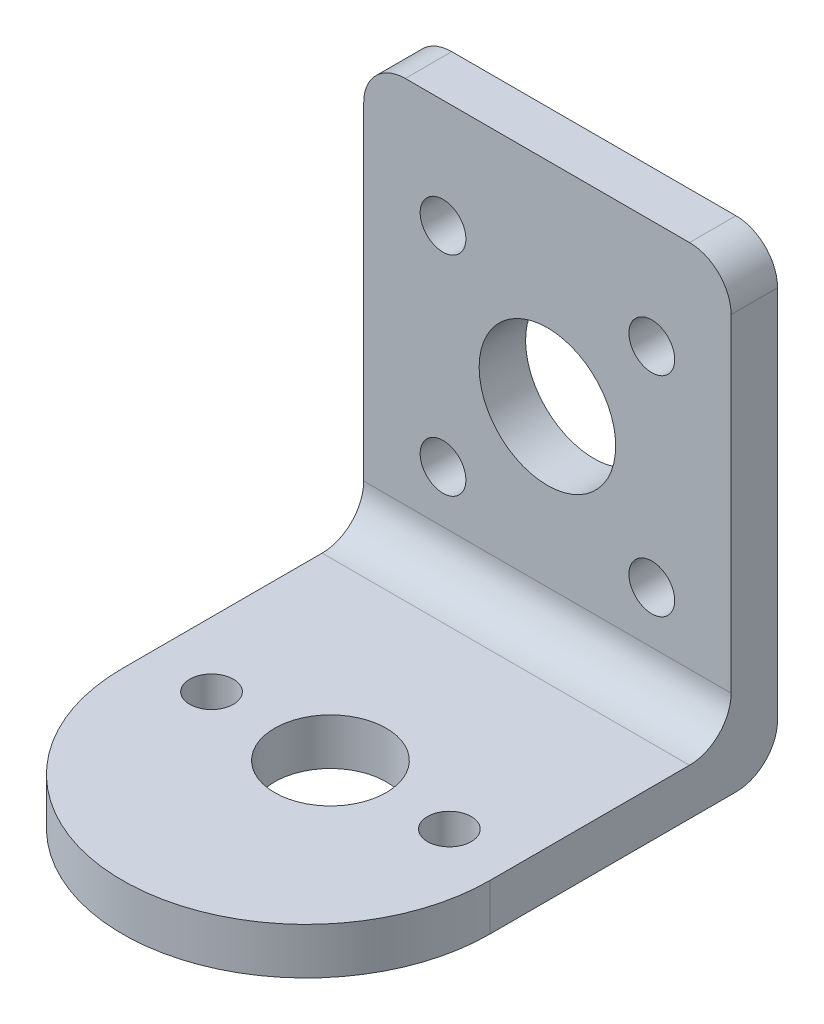
ISO-10303-21;
HEADER;
FILE_DESCRIPTION(('STEP AP214'),'2;1');
FILE_NAME('part.step','',(''),(''),'','','');
FILE_SCHEMA(('AUTOMOTIVE_DESIGN { 1 0 10303 214 1 1 1 1 }'));
ENDSEC;
DATA;
#1=APPLICATION_CONTEXT('core data for automotive mechanical design processes');
#2=APPLICATION_PROTOCOL_DEFINITION('international standard','automotive_design',2000,#1);
#3=PRODUCT_CONTEXT('',#1,'mechanical');
#4=PRODUCT('Part','Part','',(#3));
#5=PRODUCT_RELATED_PRODUCT_CATEGORY('part','',(#4));
#6=PRODUCT_DEFINITION_FORMATION('','',#4);
#7=PRODUCT_DEFINITION_CONTEXT('part definition',#1,'design');
#8=PRODUCT_DEFINITION('design','',#6,#7);
#9=PRODUCT_DEFINITION_SHAPE('','',#8);
#10=(LENGTH_UNIT() NAMED_UNIT(*) SI_UNIT(.MILLI.,.METRE.));
#11=(NAMED_UNIT(*) PLANE_ANGLE_UNIT() SI_UNIT($,.RADIAN.));
#12=(NAMED_UNIT(*) SI_UNIT($,.STERADIAN.) SOLID_ANGLE_UNIT());
#13=UNCERTAINTY_MEASURE_WITH_UNIT(LENGTH_MEASURE(1.E-05),#10,'distance_accuracy_value','');
#14=(GEOMETRIC_REPRESENTATION_CONTEXT(3) GLOBAL_UNCERTAINTY_ASSIGNED_CONTEXT((#13)) GLOBAL_UNIT_ASSIGNED_CONTEXT((#10,
#11,#12)) REPRESENTATION_CONTEXT('',''));
#15=CARTESIAN_POINT('',(0.,0.,0.));
#16=DIRECTION('',(0.,0.,1.));
#17=DIRECTION('',(1.,0.,0.));
#18=AXIS2_PLACEMENT_3D('',#15,#16,#17);
#19=CARTESIAN_POINT('',(5.71931278036326,25.1605271026006,0.));
#20=DIRECTION('',(0.,0.,-1.));
#21=DIRECTION('',(0.,1.,0.));
#22=AXIS2_PLACEMENT_3D('',#19,#20,#21);
#23=CYLINDRICAL_SURFACE('',#22,1.65);
#24=CARTESIAN_POINT('',(5.71931278036326,25.1605271026006,-34.));
#25=DIRECTION('',(0.,0.,-1.));
#26=DIRECTION('',(0.,-1.,0.));
#27=AXIS2_PLACEMENT_3D('',#24,#25,#26);
#28=CIRCLE('',#27,1.65);
#29=CARTESIAN_POINT('',(5.71931278036326,23.5105271026006,-34.));
#30=VERTEX_POINT('',#29);
#31=EDGE_CURVE('E281',#30,#30,#28,.T.);
#32=ORIENTED_EDGE('',*,*,#31,.T.);
#33=EDGE_LOOP('',(#32));
#34=FACE_BOUND('',#33,.T.);
#35=CARTESIAN_POINT('',(5.71931278036326,25.1605271026006,-30.65));
#36=DIRECTION('',(0.,0.,1.));
#37=DIRECTION('',(0.,-1.,0.));
#38=AXIS2_PLACEMENT_3D('',#35,#36,#37);
#39=CIRCLE('',#38,1.65);
#40=CARTESIAN_POINT('',(5.71931278036326,23.5105271026006,-30.65));
#41=VERTEX_POINT('',#40);
#42=EDGE_CURVE('E317',#41,#41,#39,.T.);
#43=ORIENTED_EDGE('',*,*,#42,.T.);
#44=EDGE_LOOP('',(#43));
#45=FACE_BOUND('',#44,.T.);
#46=ADVANCED_FACE('F16',(#34,#45),#23,.F.);
#47=CARTESIAN_POINT('',(20.7806872196367,25.1605271026006,0.));
#48=DIRECTION('',(0.,0.,-1.));
#49=DIRECTION('',(0.,1.,0.));
#50=AXIS2_PLACEMENT_3D('',#47,#48,#49);
#51=CYLINDRICAL_SURFACE('',#50,1.65);
#52=CARTESIAN_POINT('',(20.7806872196367,25.1605271026006,-34.));
#53=DIRECTION('',(0.,0.,-1.));
#54=DIRECTION('',(0.,1.,0.));
#55=AXIS2_PLACEMENT_3D('',#52,#53,#54);
#56=CIRCLE('',#55,1.65);
#57=CARTESIAN_POINT('',(20.7806872196367,26.8105271026006,-34.));
#58=VERTEX_POINT('',#57);
#59=EDGE_CURVE('E278',#58,#58,#56,.T.);
#60=ORIENTED_EDGE('',*,*,#59,.T.);
#61=EDGE_LOOP('',(#60));
#62=FACE_BOUND('',#61,.T.);
#63=CARTESIAN_POINT('',(20.7806872196367,25.1605271026006,-30.65));
#64=DIRECTION('',(0.,0.,1.));
#65=DIRECTION('',(0.,-1.,0.));
#66=AXIS2_PLACEMENT_3D('',#63,#64,#65);
#67=CIRCLE('',#66,1.65);
#68=CARTESIAN_POINT('',(20.7806872196367,23.5105271026006,-30.65));
#69=VERTEX_POINT('',#68);
#70=EDGE_CURVE('E320',#69,#69,#67,.T.);
#71=ORIENTED_EDGE('',*,*,#70,.T.);
#72=EDGE_LOOP('',(#71));
#73=FACE_BOUND('',#72,.T.);
#74=ADVANCED_FACE('F344',(#62,#73),#51,.F.);
#75=CARTESIAN_POINT('',(20.7806872196367,10.0991526633271,0.));
#76=DIRECTION('',(0.,0.,-1.));
#77=DIRECTION('',(0.,1.,0.));
#78=AXIS2_PLACEMENT_3D('',#75,#76,#77);
#79=CYLINDRICAL_SURFACE('',#78,1.65);
#80=CARTESIAN_POINT('',(20.7806872196367,10.0991526633271,-34.));
#81=DIRECTION('',(0.,0.,-1.));
#82=DIRECTION('',(0.,-1.,0.));
#83=AXIS2_PLACEMENT_3D('',#80,#81,#82);
#84=CIRCLE('',#83,1.65);
#85=CARTESIAN_POINT('',(20.7806872196367,8.4491526633271,-34.));
#86=VERTEX_POINT('',#85);
#87=EDGE_CURVE('E275',#86,#86,#84,.T.);
#88=ORIENTED_EDGE('',*,*,#87,.T.);
#89=EDGE_LOOP('',(#88));
#90=FACE_BOUND('',#89,.T.);
#91=CARTESIAN_POINT('',(20.7806872196367,10.0991526633271,-30.65));
#92=DIRECTION('',(0.,0.,1.));
#93=DIRECTION('',(0.,-1.,0.));
#94=AXIS2_PLACEMENT_3D('',#91,#92,#93);
#95=CIRCLE('',#94,1.65);
#96=CARTESIAN_POINT('',(20.7806872196367,8.4491526633271,-30.65));
#97=VERTEX_POINT('',#96);
#98=EDGE_CURVE('E323',#97,#97,#95,.T.);
#99=ORIENTED_EDGE('',*,*,#98,.T.);
#100=EDGE_LOOP('',(#99));
#101=FACE_BOUND('',#100,.T.);
#102=ADVANCED_FACE('F350',(#90,#101),#79,.F.);
#103=CARTESIAN_POINT('',(5.71931278036326,10.0991526633271,0.));
#104=DIRECTION('',(0.,0.,-1.));
#105=DIRECTION('',(0.,1.,0.));
#106=AXIS2_PLACEMENT_3D('',#103,#104,#105);
#107=CYLINDRICAL_SURFACE('',#106,1.65);
#108=CARTESIAN_POINT('',(5.71931278036326,10.0991526633271,-34.));
#109=DIRECTION('',(0.,0.,-1.));
#110=DIRECTION('',(0.,1.,0.));
#111=AXIS2_PLACEMENT_3D('',#108,#109,#110);
#112=CIRCLE('',#111,1.65);
#113=CARTESIAN_POINT('',(5.71931278036326,11.7491526633271,-34.));
#114=VERTEX_POINT('',#113);
#115=EDGE_CURVE('E271',#114,#114,#112,.T.);
#116=ORIENTED_EDGE('',*,*,#115,.T.);
#117=EDGE_LOOP('',(#116));
#118=FACE_BOUND('',#117,.T.);
#119=CARTESIAN_POINT('',(5.71931278036326,10.0991526633271,-30.65));
#120=DIRECTION('',(0.,0.,1.));
#121=DIRECTION('',(0.,-1.,0.));
#122=AXIS2_PLACEMENT_3D('',#119,#120,#121);
#123=CIRCLE('',#122,1.65);
#124=CARTESIAN_POINT('',(5.71931278036326,8.4491526633271,-30.65));
#125=VERTEX_POINT('',#124);
#126=EDGE_CURVE('E189',#125,#125,#123,.T.);
#127=ORIENTED_EDGE('',*,*,#126,.T.);
#128=EDGE_LOOP('',(#127));
#129=FACE_BOUND('',#128,.T.);
#130=ADVANCED_FACE('F331',(#118,#129),#107,.F.);
#131=CARTESIAN_POINT('',(13.25,17.6298398829639,0.));
#132=DIRECTION('',(0.,0.,-1.));
#133=DIRECTION('',(0.,1.,0.));
#134=AXIS2_PLACEMENT_3D('',#131,#132,#133);
#135=CYLINDRICAL_SURFACE('',#134,4.925);
#136=CARTESIAN_POINT('',(13.25,17.6298398829639,-34.));
#137=DIRECTION('',(0.,0.,-1.));
#138=DIRECTION('',(0.,1.,0.));
#139=AXIS2_PLACEMENT_3D('',#136,#137,#138);
#140=CIRCLE('',#139,4.925);
#141=CARTESIAN_POINT('',(13.25,22.5548398829639,-34.));
#142=VERTEX_POINT('',#141);
#143=EDGE_CURVE('E274',#142,#142,#140,.T.);
#144=ORIENTED_EDGE('',*,*,#143,.T.);
#145=EDGE_LOOP('',(#144));
#146=FACE_BOUND('',#145,.T.);
#147=CARTESIAN_POINT('',(13.25,17.6298398829639,-30.65));
#148=DIRECTION('',(0.,0.,1.));
#149=DIRECTION('',(0.,-1.,0.));
#150=AXIS2_PLACEMENT_3D('',#147,#148,#149);
#151=CIRCLE('',#150,4.925);
#152=CARTESIAN_POINT('',(13.25,12.7048398829639,-30.65));
#153=VERTEX_POINT('',#152);
#154=EDGE_CURVE('E181',#153,#153,#151,.T.);
#155=ORIENTED_EDGE('',*,*,#154,.T.);
#156=EDGE_LOOP('',(#155));
#157=FACE_BOUND('',#156,.T.);
#158=ADVANCED_FACE('F380',(#146,#157),#135,.F.);
#159=CARTESIAN_POINT('',(3.,30.,-34.));
#160=DIRECTION('',(0.,0.,-1.));
#161=DIRECTION('',(0.,1.,0.));
#162=AXIS2_PLACEMENT_3D('',#159,#160,#161);
#163=CYLINDRICAL_SURFACE('',#162,3.);
#164=CARTESIAN_POINT('',(3.,30.,-34.));
#165=DIRECTION('',(0.,0.,-1.));
#166=DIRECTION('',(0.,-1.,0.));
#167=AXIS2_PLACEMENT_3D('',#164,#165,#166);
#168=CIRCLE('',#167,3.);
#169=CARTESIAN_POINT('',(0.,30.,-34.));
#170=VERTEX_POINT('',#169);
#171=CARTESIAN_POINT('',(3.,33.,-34.));
#172=VERTEX_POINT('',#171);
#173=EDGE_CURVE('E257',#170,#172,#168,.T.);
#174=ORIENTED_EDGE('',*,*,#173,.F.);
#175=DIRECTION('',(0.,0.,-1.));
#176=VECTOR('',#175,1.);
#177=CARTESIAN_POINT('',(0.,30.,-34.));
#178=LINE('',#177,#176);
#179=CARTESIAN_POINT('',(0.,30.,-30.65));
#180=VERTEX_POINT('',#179);
#181=EDGE_CURVE('E47',#180,#170,#178,.T.);
#182=ORIENTED_EDGE('',*,*,#181,.F.);
#183=CARTESIAN_POINT('',(3.,30.,-30.65));
#184=DIRECTION('',(0.,0.,1.));
#185=DIRECTION('',(0.,-1.,0.));
#186=AXIS2_PLACEMENT_3D('',#183,#184,#185);
#187=CIRCLE('',#186,3.);
#188=CARTESIAN_POINT('',(3.,33.,-30.65));
#189=VERTEX_POINT('',#188);
#190=EDGE_CURVE('E187',#189,#180,#187,.T.);
#191=ORIENTED_EDGE('',*,*,#190,.F.);
#192=DIRECTION('',(0.,0.,1.));
#193=VECTOR('',#192,1.);
#194=CARTESIAN_POINT('',(3.,33.,-30.65));
#195=LINE('',#194,#193);
#196=EDGE_CURVE('E313',#172,#189,#195,.T.);
#197=ORIENTED_EDGE('',*,*,#196,.F.);
#198=EDGE_LOOP('',(#174,#182,#191,#197));
#199=FACE_BOUND('',#198,.T.);
#200=ADVANCED_FACE('F383',(#199),#163,.T.);
#201=CARTESIAN_POINT('',(23.5,30.,0.));
#202=DIRECTION('',(0.,0.,1.));
#203=DIRECTION('',(0.,-1.,0.));
#204=AXIS2_PLACEMENT_3D('',#201,#202,#203);
#205=CYLINDRICAL_SURFACE('',#204,3.);
#206=CARTESIAN_POINT('',(23.5,30.,-34.));
#207=DIRECTION('',(0.,0.,-1.));
#208=DIRECTION('',(0.,-1.,0.));
#209=AXIS2_PLACEMENT_3D('',#206,#207,#208);
#210=CIRCLE('',#209,3.);
#211=CARTESIAN_POINT('',(23.5,33.,-34.));
#212=VERTEX_POINT('',#211);
#213=CARTESIAN_POINT('',(26.5,30.,-34.));
#214=VERTEX_POINT('',#213);
#215=EDGE_CURVE('E293',#212,#214,#210,.T.);
#216=ORIENTED_EDGE('',*,*,#215,.F.);
#217=DIRECTION('',(0.,0.,-1.));
#218=VECTOR('',#217,1.);
#219=CARTESIAN_POINT('',(23.5,33.,-34.));
#220=LINE('',#219,#218);
#221=CARTESIAN_POINT('',(23.5,33.,-30.65));
#222=VERTEX_POINT('',#221);
#223=EDGE_CURVE('E256',#222,#212,#220,.T.);
#224=ORIENTED_EDGE('',*,*,#223,.F.);
#225=CARTESIAN_POINT('',(23.5,30.,-30.65));
#226=DIRECTION('',(0.,0.,1.));
#227=DIRECTION('',(0.,-1.,0.));
#228=AXIS2_PLACEMENT_3D('',#225,#226,#227);
#229=CIRCLE('',#228,3.);
#230=CARTESIAN_POINT('',(26.5,30.,-30.65));
#231=VERTEX_POINT('',#230);
#232=EDGE_CURVE('E180',#231,#222,#229,.T.);
#233=ORIENTED_EDGE('',*,*,#232,.F.);
#234=DIRECTION('',(0.,0.,1.));
#235=VECTOR('',#234,1.);
#236=CARTESIAN_POINT('',(26.5,30.,0.));
#237=LINE('',#236,#235);
#238=EDGE_CURVE('E165',#214,#231,#237,.T.);
#239=ORIENTED_EDGE('',*,*,#238,.F.);
#240=EDGE_LOOP('',(#216,#224,#233,#239));
#241=FACE_BOUND('',#240,.T.);
#242=ADVANCED_FACE('F395',(#241),#205,.T.);
#243=CARTESIAN_POINT('',(26.5,3.,-31.));
#244=DIRECTION('',(-1.,0.,0.));
#245=DIRECTION('',(0.,-1.,0.));
#246=AXIS2_PLACEMENT_3D('',#243,#244,#245);
#247=CYLINDRICAL_SURFACE('',#246,3.);
#248=CARTESIAN_POINT('',(26.5,3.,-31.));
#249=DIRECTION('',(1.,0.,0.));
#250=DIRECTION('',(0.,-1.,0.));
#251=AXIS2_PLACEMENT_3D('',#248,#249,#250);
#252=CIRCLE('',#251,3.);
#253=CARTESIAN_POINT('',(26.5,0.,-31.));
#254=VERTEX_POINT('',#253);
#255=CARTESIAN_POINT('',(26.5,3.,-34.));
#256=VERTEX_POINT('',#255);
#257=EDGE_CURVE('E201',#254,#256,#252,.T.);
#258=ORIENTED_EDGE('',*,*,#257,.F.);
#259=DIRECTION('',(1.,0.,0.));
#260=VECTOR('',#259,1.);
#261=CARTESIAN_POINT('',(26.5,0.,-31.));
#262=LINE('',#261,#260);
#263=CARTESIAN_POINT('',(0.,0.,-31.));
#264=VERTEX_POINT('',#263);
#265=EDGE_CURVE('E241',#264,#254,#262,.T.);
#266=ORIENTED_EDGE('',*,*,#265,.F.);
#267=CARTESIAN_POINT('',(0.,3.,-31.));
#268=DIRECTION('',(-1.,0.,0.));
#269=DIRECTION('',(0.,-1.,0.));
#270=AXIS2_PLACEMENT_3D('',#267,#268,#269);
#271=CIRCLE('',#270,3.);
#272=CARTESIAN_POINT('',(0.,3.,-34.));
#273=VERTEX_POINT('',#272);
#274=EDGE_CURVE('E204',#273,#264,#271,.T.);
#275=ORIENTED_EDGE('',*,*,#274,.F.);
#276=DIRECTION('',(-1.,0.,0.));
#277=VECTOR('',#276,1.);
#278=CARTESIAN_POINT('',(26.5,3.,-34.));
#279=LINE('',#278,#277);
#280=EDGE_CURVE('E300',#256,#273,#279,.T.);
#281=ORIENTED_EDGE('',*,*,#280,.F.);
#282=EDGE_LOOP('',(#258,#266,#275,#281));
#283=FACE_BOUND('',#282,.T.);
#284=ADVANCED_FACE('F398',(#283),#247,.T.);
#285=CARTESIAN_POINT('',(26.5,6.35,-27.65));
#286=DIRECTION('',(1.,0.,0.));
#287=DIRECTION('',(0.,1.,0.));
#288=AXIS2_PLACEMENT_3D('',#285,#286,#287);
#289=CYLINDRICAL_SURFACE('',#288,3.);
#290=CARTESIAN_POINT('',(26.5,6.35,-27.65));
#291=DIRECTION('',(-1.,0.,0.));
#292=DIRECTION('',(0.,-1.,0.));
#293=AXIS2_PLACEMENT_3D('',#290,#291,#292);
#294=CIRCLE('',#293,3.);
#295=CARTESIAN_POINT('',(26.5,6.35,-30.65));
#296=VERTEX_POINT('',#295);
#297=CARTESIAN_POINT('',(26.5,3.35,-27.65));
#298=VERTEX_POINT('',#297);
#299=EDGE_CURVE('E152',#296,#298,#294,.T.);
#300=ORIENTED_EDGE('',*,*,#299,.F.);
#301=DIRECTION('',(1.,0.,0.));
#302=VECTOR('',#301,1.);
#303=CARTESIAN_POINT('',(26.5,6.35,-30.65));
#304=LINE('',#303,#302);
#305=CARTESIAN_POINT('',(0.,6.35,-30.65));
#306=VERTEX_POINT('',#305);
#307=EDGE_CURVE('E155',#306,#296,#304,.T.);
#308=ORIENTED_EDGE('',*,*,#307,.F.);
#309=CARTESIAN_POINT('',(0.,6.35,-27.65));
#310=DIRECTION('',(1.,0.,0.));
#311=DIRECTION('',(0.,-1.,0.));
#312=AXIS2_PLACEMENT_3D('',#309,#310,#311);
#313=CIRCLE('',#312,3.);
#314=CARTESIAN_POINT('',(0.,3.35,-27.65));
#315=VERTEX_POINT('',#314);
#316=EDGE_CURVE('E10',#315,#306,#313,.T.);
#317=ORIENTED_EDGE('',*,*,#316,.F.);
#318=DIRECTION('',(-1.,0.,0.));
#319=VECTOR('',#318,1.);
#320=CARTESIAN_POINT('',(0.,3.35,-27.65));
#321=LINE('',#320,#319);
#322=EDGE_CURVE('E158',#298,#315,#321,.T.);
#323=ORIENTED_EDGE('',*,*,#322,.F.);
#324=EDGE_LOOP('',(#300,#308,#317,#323));
#325=FACE_BOUND('',#324,.T.);
#326=ADVANCED_FACE('F154',(#325),#289,.F.);
#327=CARTESIAN_POINT('',(21.8275,33.,-15.));
#328=DIRECTION('',(0.,-1.,0.));
#329=DIRECTION('',(1.,0.,0.));
#330=AXIS2_PLACEMENT_3D('',#327,#328,#329);
#331=CYLINDRICAL_SURFACE('',#330,1.575);
#332=CARTESIAN_POINT('',(21.8275,0.,-15.));
#333=DIRECTION('',(0.,-1.,0.));
#334=DIRECTION('',(-1.,0.,0.));
#335=AXIS2_PLACEMENT_3D('',#332,#333,#334);
#336=CIRCLE('',#335,1.575);
#337=CARTESIAN_POINT('',(20.2525,0.,-15.));
#338=VERTEX_POINT('',#337);
#339=EDGE_CURVE('E699',#338,#338,#336,.T.);
#340=ORIENTED_EDGE('',*,*,#339,.T.);
#341=EDGE_LOOP('',(#340));
#342=FACE_BOUND('',#341,.T.);
#343=CARTESIAN_POINT('',(21.8275,3.35,-15.));
#344=DIRECTION('',(0.,1.,0.));
#345=DIRECTION('',(0.,0.,1.));
#346=AXIS2_PLACEMENT_3D('',#343,#344,#345);
#347=CIRCLE('',#346,1.575);
#348=CARTESIAN_POINT('',(21.8275,3.35,-13.425));
#349=VERTEX_POINT('',#348);
#350=EDGE_CURVE('E235',#349,#349,#347,.T.);
#351=ORIENTED_EDGE('',*,*,#350,.T.);
#352=EDGE_LOOP('',(#351));
#353=FACE_BOUND('',#352,.T.);
#354=ADVANCED_FACE('F388',(#342,#353),#331,.F.);
#355=CARTESIAN_POINT('',(4.6725,33.,-15.));
#356=DIRECTION('',(0.,-1.,0.));
#357=DIRECTION('',(1.,0.,0.));
#358=AXIS2_PLACEMENT_3D('',#355,#356,#357);
#359=CYLINDRICAL_SURFACE('',#358,1.575);
#360=CARTESIAN_POINT('',(4.6725,0.,-15.));
#361=DIRECTION('',(0.,-1.,0.));
#362=DIRECTION('',(1.,0.,0.));
#363=AXIS2_PLACEMENT_3D('',#360,#361,#362);
#364=CIRCLE('',#363,1.575);
#365=CARTESIAN_POINT('',(6.2475,0.,-15.));
#366=VERTEX_POINT('',#365);
#367=EDGE_CURVE('E249',#366,#366,#364,.T.);
#368=ORIENTED_EDGE('',*,*,#367,.T.);
#369=EDGE_LOOP('',(#368));
#370=FACE_BOUND('',#369,.T.);
#371=CARTESIAN_POINT('',(4.6725,3.35,-15.));
#372=DIRECTION('',(0.,1.,0.));
#373=DIRECTION('',(0.,0.,1.));
#374=AXIS2_PLACEMENT_3D('',#371,#372,#373);
#375=CIRCLE('',#374,1.575);
#376=CARTESIAN_POINT('',(4.6725,3.35,-13.425));
#377=VERTEX_POINT('',#376);
#378=EDGE_CURVE('E261',#377,#377,#375,.T.);
#379=ORIENTED_EDGE('',*,*,#378,.T.);
#380=EDGE_LOOP('',(#379));
#381=FACE_BOUND('',#380,.T.);
#382=ADVANCED_FACE('F385',(#370,#381),#359,.F.);
#383=CARTESIAN_POINT('',(13.25,33.,-15.));
#384=DIRECTION('',(0.,-1.,0.));
#385=DIRECTION('',(1.,0.,0.));
#386=AXIS2_PLACEMENT_3D('',#383,#384,#385);
#387=CYLINDRICAL_SURFACE('',#386,4.025);
#388=CARTESIAN_POINT('',(13.25,0.,-15.));
#389=DIRECTION('',(0.,-1.,0.));
#390=DIRECTION('',(1.,0.,0.));
#391=AXIS2_PLACEMENT_3D('',#388,#389,#390);
#392=CIRCLE('',#391,4.025);
#393=CARTESIAN_POINT('',(17.275,0.,-15.));
#394=VERTEX_POINT('',#393);
#395=EDGE_CURVE('E242',#394,#394,#392,.T.);
#396=ORIENTED_EDGE('',*,*,#395,.T.);
#397=EDGE_LOOP('',(#396));
#398=FACE_BOUND('',#397,.T.);
#399=CARTESIAN_POINT('',(13.25,3.35,-15.));
#400=DIRECTION('',(0.,1.,0.));
#401=DIRECTION('',(0.,0.,1.));
#402=AXIS2_PLACEMENT_3D('',#399,#400,#401);
#403=CIRCLE('',#402,4.025);
#404=CARTESIAN_POINT('',(13.25,3.35,-10.975));
#405=VERTEX_POINT('',#404);
#406=EDGE_CURVE('E268',#405,#405,#403,.T.);
#407=ORIENTED_EDGE('',*,*,#406,.T.);
#408=EDGE_LOOP('',(#407));
#409=FACE_BOUND('',#408,.T.);
#410=ADVANCED_FACE('F379',(#398,#409),#387,.F.);
#411=CARTESIAN_POINT('',(13.25,33.,-13.25));
#412=DIRECTION('',(0.,-1.,0.));
#413=DIRECTION('',(1.,0.,0.));
#414=AXIS2_PLACEMENT_3D('',#411,#412,#413);
#415=CYLINDRICAL_SURFACE('',#414,13.25);
#416=DIRECTION('',(0.,-1.,0.));
#417=VECTOR('',#416,1.);
#418=CARTESIAN_POINT('',(0.,33.,-13.25));
#419=LINE('',#418,#417);
#420=CARTESIAN_POINT('',(0.,3.35,-13.25));
#421=VERTEX_POINT('',#420);
#422=CARTESIAN_POINT('',(0.,0.,-13.25));
#423=VERTEX_POINT('',#422);
#424=EDGE_CURVE('E24',#421,#423,#419,.T.);
#425=ORIENTED_EDGE('',*,*,#424,.T.);
#426=CARTESIAN_POINT('',(13.25,0.,-13.25));
#427=DIRECTION('',(0.,-1.,0.));
#428=DIRECTION('',(1.,0.,0.));
#429=AXIS2_PLACEMENT_3D('',#426,#427,#428);
#430=CIRCLE('',#429,13.25);
#431=CARTESIAN_POINT('',(26.5,0.,-13.25));
#432=VERTEX_POINT('',#431);
#433=EDGE_CURVE('E217',#432,#423,#430,.T.);
#434=ORIENTED_EDGE('',*,*,#433,.F.);
#435=DIRECTION('',(0.,-1.,0.));
#436=VECTOR('',#435,1.);
#437=CARTESIAN_POINT('',(26.5,33.,-13.25));
#438=LINE('',#437,#436);
#439=CARTESIAN_POINT('',(26.5,3.35,-13.25));
#440=VERTEX_POINT('',#439);
#441=EDGE_CURVE('E164',#440,#432,#438,.T.);
#442=ORIENTED_EDGE('',*,*,#441,.F.);
#443=CARTESIAN_POINT('',(13.25,3.35,-13.25));
#444=DIRECTION('',(0.,1.,0.));
#445=DIRECTION('',(0.,0.,1.));
#446=AXIS2_PLACEMENT_3D('',#443,#444,#445);
#447=CIRCLE('',#446,13.25);
#448=EDGE_CURVE('E220',#421,#440,#447,.T.);
#449=ORIENTED_EDGE('',*,*,#448,.F.);
#450=EDGE_LOOP('',(#425,#434,#442,#449));
#451=FACE_BOUND('',#450,.T.);
#452=ADVANCED_FACE('F216',(#451),#415,.T.);
#453=CARTESIAN_POINT('',(0.,0.,0.));
#454=DIRECTION('',(-1.,0.,0.));
#455=DIRECTION('',(0.,0.,1.));
#456=AXIS2_PLACEMENT_3D('',#453,#454,#455);
#457=PLANE('',#456);
#458=DIRECTION('',(0.,1.,0.));
#459=VECTOR('',#458,1.);
#460=CARTESIAN_POINT('',(0.,3.35,-30.65));
#461=LINE('',#460,#459);
#462=EDGE_CURVE('E173',#306,#180,#461,.T.);
#463=ORIENTED_EDGE('',*,*,#462,.T.);
#464=ORIENTED_EDGE('',*,*,#181,.T.);
#465=DIRECTION('',(0.,1.,0.));
#466=VECTOR('',#465,1.);
#467=CARTESIAN_POINT('',(0.,0.,-34.));
#468=LINE('',#467,#466);
#469=EDGE_CURVE('E304',#273,#170,#468,.T.);
#470=ORIENTED_EDGE('',*,*,#469,.F.);
#471=ORIENTED_EDGE('',*,*,#274,.T.);
#472=DIRECTION('',(0.,0.,-1.));
#473=VECTOR('',#472,1.);
#474=CARTESIAN_POINT('',(0.,0.,0.));
#475=LINE('',#474,#473);
#476=EDGE_CURVE('E231',#423,#264,#475,.T.);
#477=ORIENTED_EDGE('',*,*,#476,.F.);
#478=ORIENTED_EDGE('',*,*,#424,.F.);
#479=DIRECTION('',(0.,0.,-1.));
#480=VECTOR('',#479,1.);
#481=CARTESIAN_POINT('',(0.,3.35,0.));
#482=LINE('',#481,#480);
#483=EDGE_CURVE('E262',#421,#315,#482,.T.);
#484=ORIENTED_EDGE('',*,*,#483,.T.);
#485=ORIENTED_EDGE('',*,*,#316,.T.);
#486=EDGE_LOOP('',(#463,#464,#470,#471,#477,#478,#484,#485));
#487=FACE_BOUND('',#486,.T.);
#488=ADVANCED_FACE('F237',(#487),#457,.T.);
#489=CARTESIAN_POINT('',(26.5,0.,0.));
#490=DIRECTION('',(-1.,0.,0.));
#491=DIRECTION('',(0.,0.,1.));
#492=AXIS2_PLACEMENT_3D('',#489,#490,#491);
#493=PLANE('',#492);
#494=DIRECTION('',(0.,1.,0.));
#495=VECTOR('',#494,1.);
#496=CARTESIAN_POINT('',(26.5,3.35,-34.));
#497=LINE('',#496,#495);
#498=EDGE_CURVE('E297',#256,#214,#497,.T.);
#499=ORIENTED_EDGE('',*,*,#498,.T.);
#500=ORIENTED_EDGE('',*,*,#238,.T.);
#501=DIRECTION('',(0.,1.,0.));
#502=VECTOR('',#501,1.);
#503=CARTESIAN_POINT('',(26.5,3.35,-30.65));
#504=LINE('',#503,#502);
#505=EDGE_CURVE('E171',#296,#231,#504,.T.);
#506=ORIENTED_EDGE('',*,*,#505,.F.);
#507=ORIENTED_EDGE('',*,*,#299,.T.);
#508=DIRECTION('',(0.,0.,-1.));
#509=VECTOR('',#508,1.);
#510=CARTESIAN_POINT('',(26.5,3.35,0.));
#511=LINE('',#510,#509);
#512=EDGE_CURVE('E265',#440,#298,#511,.T.);
#513=ORIENTED_EDGE('',*,*,#512,.F.);
#514=ORIENTED_EDGE('',*,*,#441,.T.);
#515=DIRECTION('',(0.,0.,-1.));
#516=VECTOR('',#515,1.);
#517=CARTESIAN_POINT('',(26.5,0.,0.));
#518=LINE('',#517,#516);
#519=EDGE_CURVE('E233',#432,#254,#518,.T.);
#520=ORIENTED_EDGE('',*,*,#519,.T.);
#521=ORIENTED_EDGE('',*,*,#257,.T.);
#522=EDGE_LOOP('',(#499,#500,#506,#507,#513,#514,#520,#521));
#523=FACE_BOUND('',#522,.T.);
#524=ADVANCED_FACE('F177',(#523),#493,.F.);
#525=CARTESIAN_POINT('',(26.5,3.35,-30.65));
#526=DIRECTION('',(0.,0.,1.));
#527=DIRECTION('',(1.,0.,0.));
#528=AXIS2_PLACEMENT_3D('',#525,#526,#527);
#529=PLANE('',#528);
#530=ORIENTED_EDGE('',*,*,#505,.T.);
#531=ORIENTED_EDGE('',*,*,#232,.T.);
#532=DIRECTION('',(-1.,0.,0.));
#533=VECTOR('',#532,1.);
#534=CARTESIAN_POINT('',(26.5,33.,-30.65));
#535=LINE('',#534,#533);
#536=EDGE_CURVE('E253',#222,#189,#535,.T.);
#537=ORIENTED_EDGE('',*,*,#536,.T.);
#538=ORIENTED_EDGE('',*,*,#190,.T.);
#539=ORIENTED_EDGE('',*,*,#462,.F.);
#540=ORIENTED_EDGE('',*,*,#307,.T.);
#541=EDGE_LOOP('',(#530,#531,#537,#538,#539,#540));
#542=FACE_BOUND('',#541,.T.);
#543=ORIENTED_EDGE('',*,*,#154,.F.);
#544=EDGE_LOOP('',(#543));
#545=FACE_BOUND('',#544,.T.);
#546=ORIENTED_EDGE('',*,*,#126,.F.);
#547=EDGE_LOOP('',(#546));
#548=FACE_BOUND('',#547,.T.);
#549=ORIENTED_EDGE('',*,*,#98,.F.);
#550=EDGE_LOOP('',(#549));
#551=FACE_BOUND('',#550,.T.);
#552=ORIENTED_EDGE('',*,*,#70,.F.);
#553=EDGE_LOOP('',(#552));
#554=FACE_BOUND('',#553,.T.);
#555=ORIENTED_EDGE('',*,*,#42,.F.);
#556=EDGE_LOOP('',(#555));
#557=FACE_BOUND('',#556,.T.);
#558=ADVANCED_FACE('F169',(#542,#545,#548,#551,#554,#557),#529,.T.);
#559=CARTESIAN_POINT('',(26.5,33.,-34.));
#560=DIRECTION('',(0.,-1.,0.));
#561=DIRECTION('',(0.,0.,-1.));
#562=AXIS2_PLACEMENT_3D('',#559,#560,#561);
#563=PLANE('',#562);
#564=ORIENTED_EDGE('',*,*,#536,.F.);
#565=ORIENTED_EDGE('',*,*,#223,.T.);
#566=DIRECTION('',(-1.,0.,0.));
#567=VECTOR('',#566,1.);
#568=CARTESIAN_POINT('',(26.5,33.,-34.));
#569=LINE('',#568,#567);
#570=EDGE_CURVE('E289',#212,#172,#569,.T.);
#571=ORIENTED_EDGE('',*,*,#570,.T.);
#572=ORIENTED_EDGE('',*,*,#196,.T.);
#573=EDGE_LOOP('',(#564,#565,#571,#572));
#574=FACE_BOUND('',#573,.T.);
#575=ADVANCED_FACE('F335',(#574),#563,.F.);
#576=CARTESIAN_POINT('',(26.5,0.,-34.));
#577=DIRECTION('',(0.,0.,1.));
#578=DIRECTION('',(1.,0.,0.));
#579=AXIS2_PLACEMENT_3D('',#576,#577,#578);
#580=PLANE('',#579);
#581=ORIENTED_EDGE('',*,*,#570,.F.);
#582=ORIENTED_EDGE('',*,*,#215,.T.);
#583=ORIENTED_EDGE('',*,*,#498,.F.);
#584=ORIENTED_EDGE('',*,*,#280,.T.);
#585=ORIENTED_EDGE('',*,*,#469,.T.);
#586=ORIENTED_EDGE('',*,*,#173,.T.);
#587=EDGE_LOOP('',(#581,#582,#583,#584,#585,#586));
#588=FACE_BOUND('',#587,.T.);
#589=ORIENTED_EDGE('',*,*,#143,.F.);
#590=EDGE_LOOP('',(#589));
#591=FACE_BOUND('',#590,.T.);
#592=ORIENTED_EDGE('',*,*,#115,.F.);
#593=EDGE_LOOP('',(#592));
#594=FACE_BOUND('',#593,.T.);
#595=ORIENTED_EDGE('',*,*,#87,.F.);
#596=EDGE_LOOP('',(#595));
#597=FACE_BOUND('',#596,.T.);
#598=ORIENTED_EDGE('',*,*,#59,.F.);
#599=EDGE_LOOP('',(#598));
#600=FACE_BOUND('',#599,.T.);
#601=ORIENTED_EDGE('',*,*,#31,.F.);
#602=EDGE_LOOP('',(#601));
#603=FACE_BOUND('',#602,.T.);
#604=ADVANCED_FACE('F356',(#588,#591,#594,#597,#600,#603),#580,.F.);
#605=CARTESIAN_POINT('',(26.5,3.35,0.));
#606=DIRECTION('',(0.,1.,0.));
#607=DIRECTION('',(0.,0.,-1.));
#608=AXIS2_PLACEMENT_3D('',#605,#606,#607);
#609=PLANE('',#608);
#610=ORIENTED_EDGE('',*,*,#512,.T.);
#611=ORIENTED_EDGE('',*,*,#322,.T.);
#612=ORIENTED_EDGE('',*,*,#483,.F.);
#613=ORIENTED_EDGE('',*,*,#448,.T.);
#614=EDGE_LOOP('',(#610,#611,#612,#613));
#615=FACE_BOUND('',#614,.T.);
#616=ORIENTED_EDGE('',*,*,#406,.F.);
#617=EDGE_LOOP('',(#616));
#618=FACE_BOUND('',#617,.T.);
#619=ORIENTED_EDGE('',*,*,#378,.F.);
#620=EDGE_LOOP('',(#619));
#621=FACE_BOUND('',#620,.T.);
#622=ORIENTED_EDGE('',*,*,#350,.F.);
#623=EDGE_LOOP('',(#622));
#624=FACE_BOUND('',#623,.T.);
#625=ADVANCED_FACE('F358',(#615,#618,#621,#624),#609,.T.);
#626=CARTESIAN_POINT('',(26.5,0.,0.));
#627=DIRECTION('',(0.,1.,0.));
#628=DIRECTION('',(1.,0.,0.));
#629=AXIS2_PLACEMENT_3D('',#626,#627,#628);
#630=PLANE('',#629);
#631=ORIENTED_EDGE('',*,*,#476,.T.);
#632=ORIENTED_EDGE('',*,*,#265,.T.);
#633=ORIENTED_EDGE('',*,*,#519,.F.);
#634=ORIENTED_EDGE('',*,*,#433,.T.);
#635=EDGE_LOOP('',(#631,#632,#633,#634));
#636=FACE_BOUND('',#635,.T.);
#637=ORIENTED_EDGE('',*,*,#395,.F.);
#638=EDGE_LOOP('',(#637));
#639=FACE_BOUND('',#638,.T.);
#640=ORIENTED_EDGE('',*,*,#367,.F.);
#641=EDGE_LOOP('',(#640));
#642=FACE_BOUND('',#641,.T.);
#643=ORIENTED_EDGE('',*,*,#339,.F.);
#644=EDGE_LOOP('',(#643));
#645=FACE_BOUND('',#644,.T.);
#646=ADVANCED_FACE('F228',(#636,#639,#642,#645),#630,.F.);
#647=CLOSED_SHELL('',(#46,#74,#102,#130,#158,#200,#242,#284,#326,#354,#382,#410,#452,#488,#524,
#558,#575,#604,#625,#646));
#648=MANIFOLD_SOLID_BREP('B1',#647);
#649=ADVANCED_BREP_SHAPE_REPRESENTATION('',(#18,#648),#14);
#650=SHAPE_DEFINITION_REPRESENTATION(#9,#649);
ENDSEC;
END-ISO-10303-21;
